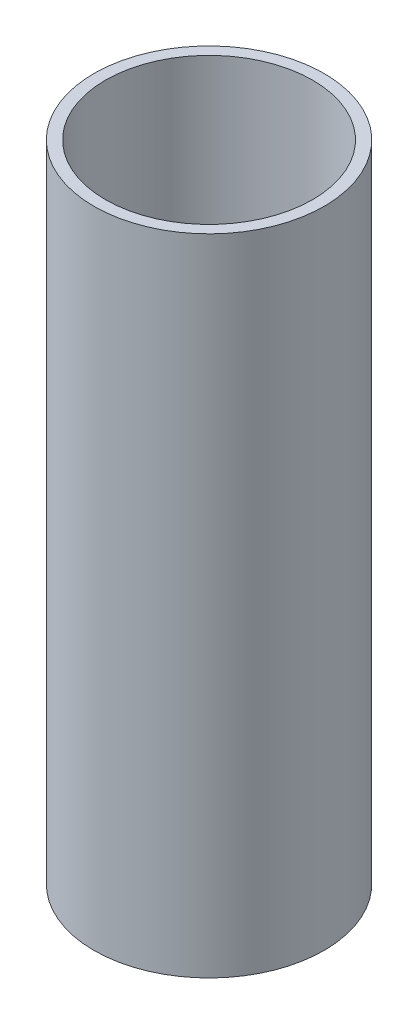
ISO-10303-21;
HEADER;
FILE_DESCRIPTION(('STEP AP214'),'2;1');
FILE_NAME('part.step','',(''),(''),'','','');
FILE_SCHEMA(('AUTOMOTIVE_DESIGN { 1 0 10303 214 1 1 1 1 }'));
ENDSEC;
DATA;
#1=APPLICATION_CONTEXT('core data for automotive mechanical design processes');
#2=APPLICATION_PROTOCOL_DEFINITION('international standard','automotive_design',2000,#1);
#3=PRODUCT_CONTEXT('',#1,'mechanical');
#4=PRODUCT('Part','Part','',(#3));
#5=PRODUCT_RELATED_PRODUCT_CATEGORY('part','',(#4));
#6=PRODUCT_DEFINITION_FORMATION('','',#4);
#7=PRODUCT_DEFINITION_CONTEXT('part definition',#1,'design');
#8=PRODUCT_DEFINITION('design','',#6,#7);
#9=PRODUCT_DEFINITION_SHAPE('','',#8);
#10=(LENGTH_UNIT() NAMED_UNIT(*) SI_UNIT(.MILLI.,.METRE.));
#11=(NAMED_UNIT(*) PLANE_ANGLE_UNIT() SI_UNIT($,.RADIAN.));
#12=(NAMED_UNIT(*) SI_UNIT($,.STERADIAN.) SOLID_ANGLE_UNIT());
#13=UNCERTAINTY_MEASURE_WITH_UNIT(LENGTH_MEASURE(1.E-05),#10,'distance_accuracy_value','');
#14=(GEOMETRIC_REPRESENTATION_CONTEXT(3) GLOBAL_UNCERTAINTY_ASSIGNED_CONTEXT((#13)) GLOBAL_UNIT_ASSIGNED_CONTEXT((#10,
#11,#12)) REPRESENTATION_CONTEXT('',''));
#15=CARTESIAN_POINT('',(0.,0.,0.));
#16=DIRECTION('',(0.,0.,1.));
#17=DIRECTION('',(1.,0.,0.));
#18=AXIS2_PLACEMENT_3D('',#15,#16,#17);
#19=CARTESIAN_POINT('',(0.,14.,0.));
#20=DIRECTION('',(0.,1.,0.));
#21=DIRECTION('',(0.,0.,1.));
#22=AXIS2_PLACEMENT_3D('',#19,#20,#21);
#23=PLANE('',#22);
#24=CARTESIAN_POINT('',(0.,14.,0.));
#25=DIRECTION('',(0.,1.,0.));
#26=DIRECTION('',(0.,0.,1.));
#27=AXIS2_PLACEMENT_3D('',#24,#25,#26);
#28=CIRCLE('',#27,5.);
#29=CARTESIAN_POINT('',(0.,14.,5.));
#30=VERTEX_POINT('',#29);
#31=EDGE_CURVE('E10',#30,#30,#28,.T.);
#32=ORIENTED_EDGE('',*,*,#31,.T.);
#33=EDGE_LOOP('',(#32));
#34=FACE_BOUND('',#33,.T.);
#35=CARTESIAN_POINT('',(0.,14.,0.));
#36=DIRECTION('',(0.,1.,0.));
#37=DIRECTION('',(0.,0.,1.));
#38=AXIS2_PLACEMENT_3D('',#35,#36,#37);
#39=CIRCLE('',#38,4.5);
#40=CARTESIAN_POINT('',(0.,14.,4.5));
#41=VERTEX_POINT('',#40);
#42=EDGE_CURVE('E42',#41,#41,#39,.T.);
#43=ORIENTED_EDGE('',*,*,#42,.F.);
#44=EDGE_LOOP('',(#43));
#45=FACE_BOUND('',#44,.T.);
#46=ADVANCED_FACE('F31',(#34,#45),#23,.T.);
#47=CARTESIAN_POINT('',(0.,-14.,0.));
#48=DIRECTION('',(0.,1.,0.));
#49=DIRECTION('',(0.,0.,1.));
#50=AXIS2_PLACEMENT_3D('',#47,#48,#49);
#51=PLANE('',#50);
#52=CARTESIAN_POINT('',(0.,-14.,0.));
#53=DIRECTION('',(0.,1.,0.));
#54=DIRECTION('',(0.,0.,1.));
#55=AXIS2_PLACEMENT_3D('',#52,#53,#54);
#56=CIRCLE('',#55,5.);
#57=CARTESIAN_POINT('',(0.,-14.,5.));
#58=VERTEX_POINT('',#57);
#59=EDGE_CURVE('E35',#58,#58,#56,.T.);
#60=ORIENTED_EDGE('',*,*,#59,.F.);
#61=EDGE_LOOP('',(#60));
#62=FACE_BOUND('',#61,.T.);
#63=CARTESIAN_POINT('',(0.,-14.,0.));
#64=DIRECTION('',(0.,1.,0.));
#65=DIRECTION('',(0.,0.,1.));
#66=AXIS2_PLACEMENT_3D('',#63,#64,#65);
#67=CIRCLE('',#66,4.5);
#68=CARTESIAN_POINT('',(0.,-14.,4.5));
#69=VERTEX_POINT('',#68);
#70=EDGE_CURVE('E44',#69,#69,#67,.T.);
#71=ORIENTED_EDGE('',*,*,#70,.T.);
#72=EDGE_LOOP('',(#71));
#73=FACE_BOUND('',#72,.T.);
#74=ADVANCED_FACE('F54',(#62,#73),#51,.F.);
#75=CARTESIAN_POINT('',(0.,14.,0.));
#76=DIRECTION('',(0.,-1.,0.));
#77=DIRECTION('',(0.,0.,-1.));
#78=AXIS2_PLACEMENT_3D('',#75,#76,#77);
#79=CYLINDRICAL_SURFACE('',#78,5.);
#80=ORIENTED_EDGE('',*,*,#31,.F.);
#81=EDGE_LOOP('',(#80));
#82=FACE_BOUND('',#81,.T.);
#83=ORIENTED_EDGE('',*,*,#59,.T.);
#84=EDGE_LOOP('',(#83));
#85=FACE_BOUND('',#84,.T.);
#86=ADVANCED_FACE('F33',(#82,#85),#79,.T.);
#87=CARTESIAN_POINT('',(0.,14.,0.));
#88=DIRECTION('',(0.,-1.,0.));
#89=DIRECTION('',(0.,0.,-1.));
#90=AXIS2_PLACEMENT_3D('',#87,#88,#89);
#91=CYLINDRICAL_SURFACE('',#90,4.5);
#92=ORIENTED_EDGE('',*,*,#42,.T.);
#93=EDGE_LOOP('',(#92));
#94=FACE_BOUND('',#93,.T.);
#95=ORIENTED_EDGE('',*,*,#70,.F.);
#96=EDGE_LOOP('',(#95));
#97=FACE_BOUND('',#96,.T.);
#98=ADVANCED_FACE('F50',(#94,#97),#91,.F.);
#99=CLOSED_SHELL('',(#46,#74,#86,#98));
#100=MANIFOLD_SOLID_BREP('B2',#99);
#101=ADVANCED_BREP_SHAPE_REPRESENTATION('',(#18,#100),#14);
#102=SHAPE_DEFINITION_REPRESENTATION(#9,#101);
ENDSEC;
END-ISO-10303-21;
